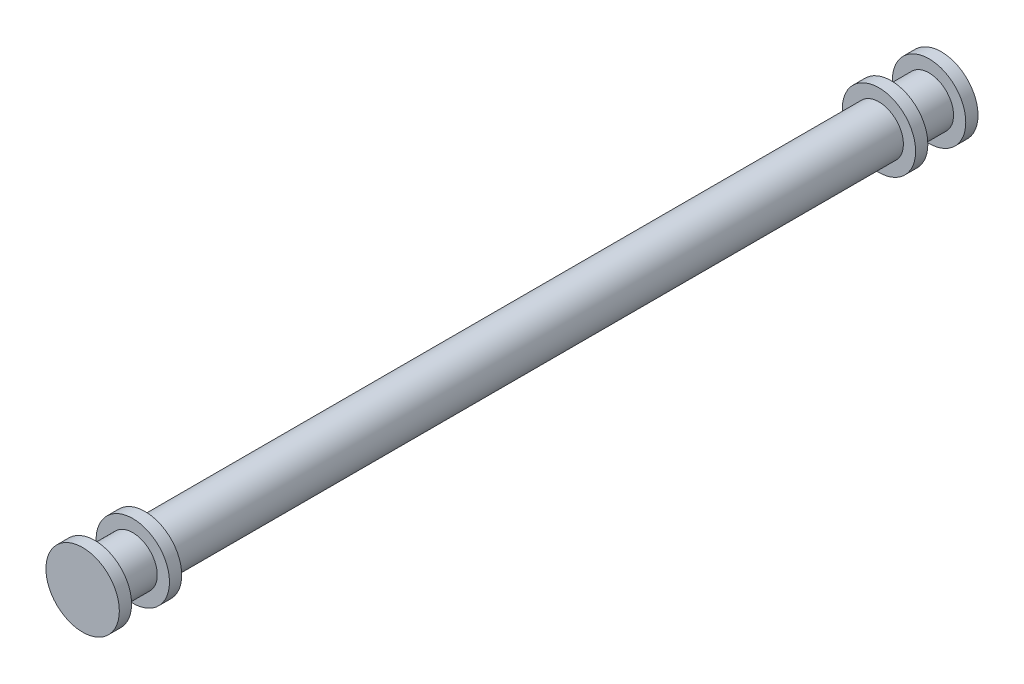
ISO-10303-21;
HEADER;
FILE_DESCRIPTION(('STEP AP214'),'2;1');
FILE_NAME('part.step','',(''),(''),'','','');
FILE_SCHEMA(('AUTOMOTIVE_DESIGN { 1 0 10303 214 1 1 1 1 }'));
ENDSEC;
DATA;
#1=APPLICATION_CONTEXT('core data for automotive mechanical design processes');
#2=APPLICATION_PROTOCOL_DEFINITION('international standard','automotive_design',2000,#1);
#3=PRODUCT_CONTEXT('',#1,'mechanical');
#4=PRODUCT('Part','Part','',(#3));
#5=PRODUCT_RELATED_PRODUCT_CATEGORY('part','',(#4));
#6=PRODUCT_DEFINITION_FORMATION('','',#4);
#7=PRODUCT_DEFINITION_CONTEXT('part definition',#1,'design');
#8=PRODUCT_DEFINITION('design','',#6,#7);
#9=PRODUCT_DEFINITION_SHAPE('','',#8);
#10=(LENGTH_UNIT() NAMED_UNIT(*) SI_UNIT(.MILLI.,.METRE.));
#11=(NAMED_UNIT(*) PLANE_ANGLE_UNIT() SI_UNIT($,.RADIAN.));
#12=(NAMED_UNIT(*) SI_UNIT($,.STERADIAN.) SOLID_ANGLE_UNIT());
#13=UNCERTAINTY_MEASURE_WITH_UNIT(LENGTH_MEASURE(1.E-05),#10,'distance_accuracy_value','');
#14=(GEOMETRIC_REPRESENTATION_CONTEXT(3) GLOBAL_UNCERTAINTY_ASSIGNED_CONTEXT((#13)) GLOBAL_UNIT_ASSIGNED_CONTEXT((#10,
#11,#12)) REPRESENTATION_CONTEXT('',''));
#15=CARTESIAN_POINT('',(0.,0.,0.));
#16=DIRECTION('',(0.,0.,1.));
#17=DIRECTION('',(1.,0.,0.));
#18=AXIS2_PLACEMENT_3D('',#15,#16,#17);
#19=CARTESIAN_POINT('',(0.,0.,60.));
#20=DIRECTION('',(0.,0.,-1.));
#21=DIRECTION('',(-1.,0.,0.));
#22=AXIS2_PLACEMENT_3D('',#19,#20,#21);
#23=CYLINDRICAL_SURFACE('',#22,4.);
#24=CARTESIAN_POINT('',(0.,0.,60.));
#25=DIRECTION('',(0.,0.,1.));
#26=DIRECTION('',(1.,0.,0.));
#27=AXIS2_PLACEMENT_3D('',#24,#25,#26);
#28=CIRCLE('',#27,4.);
#29=CARTESIAN_POINT('',(4.,0.,60.));
#30=VERTEX_POINT('',#29);
#31=EDGE_CURVE('E45',#30,#30,#28,.T.);
#32=ORIENTED_EDGE('',*,*,#31,.F.);
#33=EDGE_LOOP('',(#32));
#34=FACE_BOUND('',#33,.T.);
#35=CARTESIAN_POINT('',(0.,0.,-60.));
#36=DIRECTION('',(0.,0.,1.));
#37=DIRECTION('',(1.,0.,0.));
#38=AXIS2_PLACEMENT_3D('',#35,#36,#37);
#39=CIRCLE('',#38,4.);
#40=CARTESIAN_POINT('',(4.,0.,-60.));
#41=VERTEX_POINT('',#40);
#42=EDGE_CURVE('E40',#41,#41,#39,.T.);
#43=ORIENTED_EDGE('',*,*,#42,.T.);
#44=EDGE_LOOP('',(#43));
#45=FACE_BOUND('',#44,.T.);
#46=ADVANCED_FACE('F37',(#34,#45),#23,.T.);
#47=CARTESIAN_POINT('',(0.,0.,62.));
#48=DIRECTION('',(0.,0.,-1.));
#49=DIRECTION('',(-1.,0.,0.));
#50=AXIS2_PLACEMENT_3D('',#47,#48,#49);
#51=CYLINDRICAL_SURFACE('',#50,6.);
#52=CARTESIAN_POINT('',(0.,0.,62.));
#53=DIRECTION('',(0.,0.,1.));
#54=DIRECTION('',(1.,0.,0.));
#55=AXIS2_PLACEMENT_3D('',#52,#53,#54);
#56=CIRCLE('',#55,6.);
#57=CARTESIAN_POINT('',(6.,0.,62.));
#58=VERTEX_POINT('',#57);
#59=EDGE_CURVE('E51',#58,#58,#56,.T.);
#60=ORIENTED_EDGE('',*,*,#59,.F.);
#61=EDGE_LOOP('',(#60));
#62=FACE_BOUND('',#61,.T.);
#63=CARTESIAN_POINT('',(0.,0.,60.));
#64=DIRECTION('',(0.,0.,1.));
#65=DIRECTION('',(1.,0.,0.));
#66=AXIS2_PLACEMENT_3D('',#63,#64,#65);
#67=CIRCLE('',#66,6.);
#68=CARTESIAN_POINT('',(6.,0.,60.));
#69=VERTEX_POINT('',#68);
#70=EDGE_CURVE('E59',#69,#69,#67,.T.);
#71=ORIENTED_EDGE('',*,*,#70,.T.);
#72=EDGE_LOOP('',(#71));
#73=FACE_BOUND('',#72,.T.);
#74=ADVANCED_FACE('F119',(#62,#73),#51,.T.);
#75=CARTESIAN_POINT('',(0.,0.,62.));
#76=DIRECTION('',(0.,0.,1.));
#77=DIRECTION('',(1.,0.,0.));
#78=AXIS2_PLACEMENT_3D('',#75,#76,#77);
#79=PLANE('',#78);
#80=CARTESIAN_POINT('',(0.,0.,62.));
#81=DIRECTION('',(0.,0.,1.));
#82=DIRECTION('',(1.,0.,0.));
#83=AXIS2_PLACEMENT_3D('',#80,#81,#82);
#84=CIRCLE('',#83,4.);
#85=CARTESIAN_POINT('',(-4.,0.,62.));
#86=VERTEX_POINT('',#85);
#87=EDGE_CURVE('E10',#86,#86,#84,.T.);
#88=ORIENTED_EDGE('',*,*,#87,.F.);
#89=EDGE_LOOP('',(#88));
#90=FACE_BOUND('',#89,.T.);
#91=ORIENTED_EDGE('',*,*,#59,.T.);
#92=EDGE_LOOP('',(#91));
#93=FACE_BOUND('',#92,.T.);
#94=ADVANCED_FACE('F124',(#90,#93),#79,.T.);
#95=CARTESIAN_POINT('',(0.,0.,60.));
#96=DIRECTION('',(0.,0.,1.));
#97=DIRECTION('',(1.,0.,0.));
#98=AXIS2_PLACEMENT_3D('',#95,#96,#97);
#99=PLANE('',#98);
#100=ORIENTED_EDGE('',*,*,#31,.T.);
#101=EDGE_LOOP('',(#100));
#102=FACE_BOUND('',#101,.T.);
#103=ORIENTED_EDGE('',*,*,#70,.F.);
#104=EDGE_LOOP('',(#103));
#105=FACE_BOUND('',#104,.T.);
#106=ADVANCED_FACE('F162',(#102,#105),#99,.F.);
#107=CARTESIAN_POINT('',(0.,0.,68.2));
#108=DIRECTION('',(0.,0.,-1.));
#109=DIRECTION('',(-1.,0.,0.));
#110=AXIS2_PLACEMENT_3D('',#107,#108,#109);
#111=CYLINDRICAL_SURFACE('',#110,4.);
#112=CARTESIAN_POINT('',(0.,0.,68.2));
#113=DIRECTION('',(0.,0.,1.));
#114=DIRECTION('',(1.,0.,0.));
#115=AXIS2_PLACEMENT_3D('',#112,#113,#114);
#116=CIRCLE('',#115,4.);
#117=CARTESIAN_POINT('',(-4.,0.,68.2));
#118=VERTEX_POINT('',#117);
#119=EDGE_CURVE('E54',#118,#118,#116,.T.);
#120=CARTESIAN_POINT('',(-4.,0.,68.2));
#121=CARTESIAN_POINT('',(-4.,0.,68.1354166666667));
#122=CARTESIAN_POINT('',(-4.,0.,68.0708333333333));
#123=CARTESIAN_POINT('',(-4.,0.,67.9416666666666));
#124=CARTESIAN_POINT('',(-4.,0.,67.8770833333333));
#125=CARTESIAN_POINT('',(-4.,0.,67.7479166666667));
#126=CARTESIAN_POINT('',(-4.,0.,67.6833333333333));
#127=CARTESIAN_POINT('',(-4.,0.,67.5541666666666));
#128=CARTESIAN_POINT('',(-4.,0.,67.4895833333333));
#129=CARTESIAN_POINT('',(-4.,0.,67.3604166666667));
#130=CARTESIAN_POINT('',(-4.,0.,67.2958333333333));
#131=CARTESIAN_POINT('',(-4.,0.,67.1666666666667));
#132=CARTESIAN_POINT('',(-4.,0.,67.1020833333333));
#133=CARTESIAN_POINT('',(-4.,0.,66.9729166666667));
#134=CARTESIAN_POINT('',(-4.,0.,66.9083333333333));
#135=CARTESIAN_POINT('',(-4.,0.,66.7791666666667));
#136=CARTESIAN_POINT('',(-4.,0.,66.7145833333333));
#137=CARTESIAN_POINT('',(-4.,0.,66.5854166666667));
#138=CARTESIAN_POINT('',(-4.,0.,66.5208333333333));
#139=CARTESIAN_POINT('',(-4.,0.,66.3916666666667));
#140=CARTESIAN_POINT('',(-4.,0.,66.3270833333333));
#141=CARTESIAN_POINT('',(-4.,0.,66.1979166666667));
#142=CARTESIAN_POINT('',(-4.,0.,66.1333333333333));
#143=CARTESIAN_POINT('',(-4.,0.,66.0041666666666));
#144=CARTESIAN_POINT('',(-4.,0.,65.9395833333333));
#145=CARTESIAN_POINT('',(-4.,0.,65.8104166666667));
#146=CARTESIAN_POINT('',(-4.,0.,65.7458333333333));
#147=CARTESIAN_POINT('',(-4.,0.,65.6166666666667));
#148=CARTESIAN_POINT('',(-4.,0.,65.5520833333333));
#149=CARTESIAN_POINT('',(-4.,0.,65.4229166666667));
#150=CARTESIAN_POINT('',(-4.,0.,65.3583333333333));
#151=CARTESIAN_POINT('',(-4.,0.,65.2291666666667));
#152=CARTESIAN_POINT('',(-4.,0.,65.1645833333333));
#153=CARTESIAN_POINT('',(-4.,0.,65.0354166666667));
#154=CARTESIAN_POINT('',(-4.,0.,64.9708333333333));
#155=CARTESIAN_POINT('',(-4.,0.,64.8416666666667));
#156=CARTESIAN_POINT('',(-4.,0.,64.7770833333333));
#157=CARTESIAN_POINT('',(-4.,0.,64.6479166666666));
#158=CARTESIAN_POINT('',(-4.,0.,64.5833333333333));
#159=CARTESIAN_POINT('',(-4.,0.,64.4541666666667));
#160=CARTESIAN_POINT('',(-4.,0.,64.3895833333333));
#161=CARTESIAN_POINT('',(-4.,0.,64.2604166666667));
#162=CARTESIAN_POINT('',(-4.,0.,64.1958333333333));
#163=CARTESIAN_POINT('',(-4.,0.,64.0666666666667));
#164=CARTESIAN_POINT('',(-4.,0.,64.0020833333333));
#165=CARTESIAN_POINT('',(-4.,0.,63.8729166666667));
#166=CARTESIAN_POINT('',(-4.,0.,63.8083333333333));
#167=CARTESIAN_POINT('',(-4.,0.,63.6791666666667));
#168=CARTESIAN_POINT('',(-4.,0.,63.6145833333333));
#169=CARTESIAN_POINT('',(-4.,0.,63.4854166666667));
#170=CARTESIAN_POINT('',(-4.,0.,63.4208333333333));
#171=CARTESIAN_POINT('',(-4.,0.,63.2916666666667));
#172=CARTESIAN_POINT('',(-4.,0.,63.2270833333333));
#173=CARTESIAN_POINT('',(-4.,0.,63.0979166666667));
#174=CARTESIAN_POINT('',(-4.,0.,63.0333333333333));
#175=CARTESIAN_POINT('',(-4.,0.,62.9041666666667));
#176=CARTESIAN_POINT('',(-4.,0.,62.8395833333333));
#177=CARTESIAN_POINT('',(-4.,0.,62.7104166666667));
#178=CARTESIAN_POINT('',(-4.,0.,62.6458333333333));
#179=CARTESIAN_POINT('',(-4.,0.,62.5166666666667));
#180=CARTESIAN_POINT('',(-4.,0.,62.4520833333333));
#181=CARTESIAN_POINT('',(-4.,0.,62.3229166666667));
#182=CARTESIAN_POINT('',(-4.,0.,62.2583333333333));
#183=CARTESIAN_POINT('',(-4.,0.,62.1291666666667));
#184=CARTESIAN_POINT('',(-4.,0.,62.0645833333333));
#185=CARTESIAN_POINT('',(-4.,0.,62.));
#186=B_SPLINE_CURVE_WITH_KNOTS('',3,(#120,#121,#122,#123,#124,#125,#126,#127,#128,#129,#130,
#131,#132,#133,#134,#135,#136,#137,#138,#139,#140,#141,#142,#143,#144,#145,#146,#147,#148,#149,
#150,#151,#152,#153,#154,#155,#156,#157,#158,#159,#160,#161,#162,#163,#164,#165,#166,#167,#168,
#169,#170,#171,#172,#173,#174,#175,#176,#177,#178,#179,#180,#181,#182,#183,#184,#185),
.UNSPECIFIED.,.F.,.F.,(4,2,2,2,2,2,2,2,2,2,2,2,2,2,2,2,2,2,2,2,2,2,2,2,2,2,2,2,2,2,2,2,4),(0.,
0.193750000000006,0.387500000000013,0.581250000000005,0.775000000000012,0.968750000000004,
1.16250000000001,1.35625,1.55000000000001,1.74375,1.93750000000001,2.13125,2.32500000000001,
2.51875,2.71250000000001,2.90625,3.10000000000001,3.29375,3.4875,3.68125000000001,3.875,4.06875,
4.2625,4.45625000000001,4.65,4.84375000000001,5.0375,5.23125000000001,5.425,5.61875000000001,
5.8125,6.00625,6.2),.UNSPECIFIED.);
#187=EDGE_CURVE('BSEAM158',#118,#86,#186,.T.);
#188=ORIENTED_EDGE('',*,*,#119,.F.);
#189=ORIENTED_EDGE('',*,*,#87,.T.);
#190=ORIENTED_EDGE('',*,*,#187,.T.);
#191=ORIENTED_EDGE('',*,*,#187,.F.);
#192=EDGE_LOOP('',(#188,#190,#189,#191));
#193=FACE_BOUND('',#192,.T.);
#194=ADVANCED_FACE('F158',(#193),#111,.T.);
#195=CARTESIAN_POINT('',(0.,0.,70.2));
#196=DIRECTION('',(0.,0.,-1.));
#197=DIRECTION('',(-1.,0.,0.));
#198=AXIS2_PLACEMENT_3D('',#195,#196,#197);
#199=CYLINDRICAL_SURFACE('',#198,6.);
#200=CARTESIAN_POINT('',(0.,0.,70.2));
#201=DIRECTION('',(0.,0.,1.));
#202=DIRECTION('',(1.,0.,0.));
#203=AXIS2_PLACEMENT_3D('',#200,#201,#202);
#204=CIRCLE('',#203,6.);
#205=CARTESIAN_POINT('',(6.,0.,70.2));
#206=VERTEX_POINT('',#205);
#207=EDGE_CURVE('E66',#206,#206,#204,.T.);
#208=ORIENTED_EDGE('',*,*,#207,.F.);
#209=EDGE_LOOP('',(#208));
#210=FACE_BOUND('',#209,.T.);
#211=CARTESIAN_POINT('',(0.,0.,68.2));
#212=DIRECTION('',(0.,0.,1.));
#213=DIRECTION('',(1.,0.,0.));
#214=AXIS2_PLACEMENT_3D('',#211,#212,#213);
#215=CIRCLE('',#214,6.);
#216=CARTESIAN_POINT('',(6.,0.,68.2));
#217=VERTEX_POINT('',#216);
#218=EDGE_CURVE('E71',#217,#217,#215,.T.);
#219=ORIENTED_EDGE('',*,*,#218,.T.);
#220=EDGE_LOOP('',(#219));
#221=FACE_BOUND('',#220,.T.);
#222=ADVANCED_FACE('F154',(#210,#221),#199,.T.);
#223=CARTESIAN_POINT('',(0.,0.,70.2));
#224=DIRECTION('',(0.,0.,1.));
#225=DIRECTION('',(1.,0.,0.));
#226=AXIS2_PLACEMENT_3D('',#223,#224,#225);
#227=PLANE('',#226);
#228=ORIENTED_EDGE('',*,*,#207,.T.);
#229=EDGE_LOOP('',(#228));
#230=FACE_BOUND('',#229,.T.);
#231=ADVANCED_FACE('F150',(#230),#227,.T.);
#232=CARTESIAN_POINT('',(0.,0.,68.2));
#233=DIRECTION('',(0.,0.,1.));
#234=DIRECTION('',(1.,0.,0.));
#235=AXIS2_PLACEMENT_3D('',#232,#233,#234);
#236=PLANE('',#235);
#237=ORIENTED_EDGE('',*,*,#119,.T.);
#238=EDGE_LOOP('',(#237));
#239=FACE_BOUND('',#238,.T.);
#240=ORIENTED_EDGE('',*,*,#218,.F.);
#241=EDGE_LOOP('',(#240));
#242=FACE_BOUND('',#241,.T.);
#243=ADVANCED_FACE('F141',(#239,#242),#236,.F.);
#244=CARTESIAN_POINT('',(0.,0.,-62.));
#245=DIRECTION('',(0.,0.,1.));
#246=DIRECTION('',(1.,0.,0.));
#247=AXIS2_PLACEMENT_3D('',#244,#245,#246);
#248=CYLINDRICAL_SURFACE('',#247,6.);
#249=CARTESIAN_POINT('',(0.,0.,-62.));
#250=DIRECTION('',(0.,0.,1.));
#251=DIRECTION('',(1.,0.,0.));
#252=AXIS2_PLACEMENT_3D('',#249,#250,#251);
#253=CIRCLE('',#252,6.);
#254=CARTESIAN_POINT('',(6.,0.,-62.));
#255=VERTEX_POINT('',#254);
#256=EDGE_CURVE('E82',#255,#255,#253,.T.);
#257=ORIENTED_EDGE('',*,*,#256,.T.);
#258=EDGE_LOOP('',(#257));
#259=FACE_BOUND('',#258,.T.);
#260=CARTESIAN_POINT('',(0.,0.,-60.));
#261=DIRECTION('',(0.,0.,1.));
#262=DIRECTION('',(1.,0.,0.));
#263=AXIS2_PLACEMENT_3D('',#260,#261,#262);
#264=CIRCLE('',#263,6.);
#265=CARTESIAN_POINT('',(6.,0.,-60.));
#266=VERTEX_POINT('',#265);
#267=EDGE_CURVE('E78',#266,#266,#264,.T.);
#268=ORIENTED_EDGE('',*,*,#267,.F.);
#269=EDGE_LOOP('',(#268));
#270=FACE_BOUND('',#269,.T.);
#271=ADVANCED_FACE('F139',(#259,#270),#248,.T.);
#272=CARTESIAN_POINT('',(0.,0.,-62.));
#273=DIRECTION('',(0.,0.,-1.));
#274=DIRECTION('',(1.,0.,0.));
#275=AXIS2_PLACEMENT_3D('',#272,#273,#274);
#276=PLANE('',#275);
#277=CARTESIAN_POINT('',(0.,0.,-62.));
#278=DIRECTION('',(0.,0.,1.));
#279=DIRECTION('',(1.,0.,0.));
#280=AXIS2_PLACEMENT_3D('',#277,#278,#279);
#281=CIRCLE('',#280,4.);
#282=CARTESIAN_POINT('',(4.,0.,-62.));
#283=VERTEX_POINT('',#282);
#284=EDGE_CURVE('E83',#283,#283,#281,.T.);
#285=ORIENTED_EDGE('',*,*,#284,.T.);
#286=EDGE_LOOP('',(#285));
#287=FACE_BOUND('',#286,.T.);
#288=ORIENTED_EDGE('',*,*,#256,.F.);
#289=EDGE_LOOP('',(#288));
#290=FACE_BOUND('',#289,.T.);
#291=ADVANCED_FACE('F135',(#287,#290),#276,.T.);
#292=CARTESIAN_POINT('',(0.,0.,-60.));
#293=DIRECTION('',(0.,0.,-1.));
#294=DIRECTION('',(1.,0.,0.));
#295=AXIS2_PLACEMENT_3D('',#292,#293,#294);
#296=PLANE('',#295);
#297=ORIENTED_EDGE('',*,*,#42,.F.);
#298=EDGE_LOOP('',(#297));
#299=FACE_BOUND('',#298,.T.);
#300=ORIENTED_EDGE('',*,*,#267,.T.);
#301=EDGE_LOOP('',(#300));
#302=FACE_BOUND('',#301,.T.);
#303=ADVANCED_FACE('F132',(#299,#302),#296,.F.);
#304=CARTESIAN_POINT('',(0.,0.,-68.2));
#305=DIRECTION('',(0.,0.,1.));
#306=DIRECTION('',(1.,0.,0.));
#307=AXIS2_PLACEMENT_3D('',#304,#305,#306);
#308=CYLINDRICAL_SURFACE('',#307,4.);
#309=CARTESIAN_POINT('',(0.,0.,-68.2));
#310=DIRECTION('',(0.,0.,1.));
#311=DIRECTION('',(1.,0.,0.));
#312=AXIS2_PLACEMENT_3D('',#309,#310,#311);
#313=CIRCLE('',#312,4.);
#314=CARTESIAN_POINT('',(4.,0.,-68.2));
#315=VERTEX_POINT('',#314);
#316=EDGE_CURVE('E90',#315,#315,#313,.T.);
#317=CARTESIAN_POINT('',(4.,0.,-68.2));
#318=CARTESIAN_POINT('',(4.,0.,-68.1354166666667));
#319=CARTESIAN_POINT('',(4.,0.,-68.0708333333333));
#320=CARTESIAN_POINT('',(4.,0.,-67.9416666666667));
#321=CARTESIAN_POINT('',(4.,0.,-67.8770833333333));
#322=CARTESIAN_POINT('',(4.,0.,-67.7479166666667));
#323=CARTESIAN_POINT('',(4.,0.,-67.6833333333333));
#324=CARTESIAN_POINT('',(4.,0.,-67.5541666666667));
#325=CARTESIAN_POINT('',(4.,0.,-67.4895833333333));
#326=CARTESIAN_POINT('',(4.,0.,-67.3604166666667));
#327=CARTESIAN_POINT('',(4.,0.,-67.2958333333333));
#328=CARTESIAN_POINT('',(4.,0.,-67.1666666666667));
#329=CARTESIAN_POINT('',(4.,0.,-67.1020833333333));
#330=CARTESIAN_POINT('',(4.,0.,-66.9729166666667));
#331=CARTESIAN_POINT('',(4.,0.,-66.9083333333333));
#332=CARTESIAN_POINT('',(4.,0.,-66.7791666666667));
#333=CARTESIAN_POINT('',(4.,0.,-66.7145833333333));
#334=CARTESIAN_POINT('',(4.,0.,-66.5854166666667));
#335=CARTESIAN_POINT('',(4.,0.,-66.5208333333333));
#336=CARTESIAN_POINT('',(4.,0.,-66.3916666666667));
#337=CARTESIAN_POINT('',(4.,0.,-66.3270833333333));
#338=CARTESIAN_POINT('',(4.,0.,-66.1979166666667));
#339=CARTESIAN_POINT('',(4.,0.,-66.1333333333333));
#340=CARTESIAN_POINT('',(4.,0.,-66.0041666666667));
#341=CARTESIAN_POINT('',(4.,0.,-65.9395833333333));
#342=CARTESIAN_POINT('',(4.,0.,-65.8104166666667));
#343=CARTESIAN_POINT('',(4.,0.,-65.7458333333333));
#344=CARTESIAN_POINT('',(4.,0.,-65.6166666666667));
#345=CARTESIAN_POINT('',(4.,0.,-65.5520833333333));
#346=CARTESIAN_POINT('',(4.,0.,-65.4229166666667));
#347=CARTESIAN_POINT('',(4.,0.,-65.3583333333333));
#348=CARTESIAN_POINT('',(4.,0.,-65.2291666666667));
#349=CARTESIAN_POINT('',(4.,0.,-65.1645833333333));
#350=CARTESIAN_POINT('',(4.,0.,-65.0354166666667));
#351=CARTESIAN_POINT('',(4.,0.,-64.9708333333333));
#352=CARTESIAN_POINT('',(4.,0.,-64.8416666666667));
#353=CARTESIAN_POINT('',(4.,0.,-64.7770833333333));
#354=CARTESIAN_POINT('',(4.,0.,-64.6479166666667));
#355=CARTESIAN_POINT('',(4.,0.,-64.5833333333333));
#356=CARTESIAN_POINT('',(4.,0.,-64.4541666666667));
#357=CARTESIAN_POINT('',(4.,0.,-64.3895833333333));
#358=CARTESIAN_POINT('',(4.,0.,-64.2604166666667));
#359=CARTESIAN_POINT('',(4.,0.,-64.1958333333333));
#360=CARTESIAN_POINT('',(4.,0.,-64.0666666666667));
#361=CARTESIAN_POINT('',(4.,0.,-64.0020833333333));
#362=CARTESIAN_POINT('',(4.,0.,-63.8729166666667));
#363=CARTESIAN_POINT('',(4.,0.,-63.8083333333333));
#364=CARTESIAN_POINT('',(4.,0.,-63.6791666666667));
#365=CARTESIAN_POINT('',(4.,0.,-63.6145833333333));
#366=CARTESIAN_POINT('',(4.,0.,-63.4854166666667));
#367=CARTESIAN_POINT('',(4.,0.,-63.4208333333333));
#368=CARTESIAN_POINT('',(4.,0.,-63.2916666666667));
#369=CARTESIAN_POINT('',(4.,0.,-63.2270833333333));
#370=CARTESIAN_POINT('',(4.,0.,-63.0979166666667));
#371=CARTESIAN_POINT('',(4.,0.,-63.0333333333333));
#372=CARTESIAN_POINT('',(4.,0.,-62.9041666666667));
#373=CARTESIAN_POINT('',(4.,0.,-62.8395833333333));
#374=CARTESIAN_POINT('',(4.,0.,-62.7104166666667));
#375=CARTESIAN_POINT('',(4.,0.,-62.6458333333333));
#376=CARTESIAN_POINT('',(4.,0.,-62.5166666666667));
#377=CARTESIAN_POINT('',(4.,0.,-62.4520833333333));
#378=CARTESIAN_POINT('',(4.,0.,-62.3229166666667));
#379=CARTESIAN_POINT('',(4.,0.,-62.2583333333333));
#380=CARTESIAN_POINT('',(4.,0.,-62.1291666666667));
#381=CARTESIAN_POINT('',(4.,0.,-62.0645833333333));
#382=CARTESIAN_POINT('',(4.,0.,-62.));
#383=B_SPLINE_CURVE_WITH_KNOTS('',3,(#317,#318,#319,#320,#321,#322,#323,#324,#325,#326,#327,
#328,#329,#330,#331,#332,#333,#334,#335,#336,#337,#338,#339,#340,#341,#342,#343,#344,#345,#346,
#347,#348,#349,#350,#351,#352,#353,#354,#355,#356,#357,#358,#359,#360,#361,#362,#363,#364,#365,
#366,#367,#368,#369,#370,#371,#372,#373,#374,#375,#376,#377,#378,#379,#380,#381,#382),
.UNSPECIFIED.,.F.,.F.,(4,2,2,2,2,2,2,2,2,2,2,2,2,2,2,2,2,2,2,2,2,2,2,2,2,2,2,2,2,2,2,2,4),(0.,
0.193749999999993,0.387499999999999,0.581249999999991,0.774999999999998,0.96874999999999,1.1625,
1.35624999999999,1.55,1.74374999999999,1.93749999999999,2.13124999999999,2.32499999999999,
2.51874999999999,2.71249999999999,2.90625,3.09999999999999,3.29375,3.48749999999999,3.68125,
3.87499999999999,4.06875,4.26249999999999,4.45625,4.64999999999999,4.84374999999999,
5.03749999999999,5.23124999999999,5.425,5.61874999999999,5.81249999999999,6.00624999999999,
6.19999999999999),.UNSPECIFIED.);
#384=EDGE_CURVE('BSEAM116',#315,#283,#383,.T.);
#385=ORIENTED_EDGE('',*,*,#316,.T.);
#386=ORIENTED_EDGE('',*,*,#284,.F.);
#387=ORIENTED_EDGE('',*,*,#384,.T.);
#388=ORIENTED_EDGE('',*,*,#384,.F.);
#389=EDGE_LOOP('',(#385,#387,#386,#388));
#390=FACE_BOUND('',#389,.T.);
#391=ADVANCED_FACE('F116',(#390),#308,.T.);
#392=CARTESIAN_POINT('',(0.,0.,-70.2));
#393=DIRECTION('',(0.,0.,1.));
#394=DIRECTION('',(1.,0.,0.));
#395=AXIS2_PLACEMENT_3D('',#392,#393,#394);
#396=CYLINDRICAL_SURFACE('',#395,6.);
#397=CARTESIAN_POINT('',(0.,0.,-70.2));
#398=DIRECTION('',(0.,0.,1.));
#399=DIRECTION('',(1.,0.,0.));
#400=AXIS2_PLACEMENT_3D('',#397,#398,#399);
#401=CIRCLE('',#400,6.);
#402=CARTESIAN_POINT('',(6.,0.,-70.2));
#403=VERTEX_POINT('',#402);
#404=EDGE_CURVE('E94',#403,#403,#401,.T.);
#405=ORIENTED_EDGE('',*,*,#404,.T.);
#406=EDGE_LOOP('',(#405));
#407=FACE_BOUND('',#406,.T.);
#408=CARTESIAN_POINT('',(0.,0.,-68.2));
#409=DIRECTION('',(0.,0.,1.));
#410=DIRECTION('',(1.,0.,0.));
#411=AXIS2_PLACEMENT_3D('',#408,#409,#410);
#412=CIRCLE('',#411,6.);
#413=CARTESIAN_POINT('',(6.,0.,-68.2));
#414=VERTEX_POINT('',#413);
#415=EDGE_CURVE('E95',#414,#414,#412,.T.);
#416=ORIENTED_EDGE('',*,*,#415,.F.);
#417=EDGE_LOOP('',(#416));
#418=FACE_BOUND('',#417,.T.);
#419=ADVANCED_FACE('F103',(#407,#418),#396,.T.);
#420=CARTESIAN_POINT('',(0.,0.,-70.2));
#421=DIRECTION('',(0.,0.,-1.));
#422=DIRECTION('',(1.,0.,0.));
#423=AXIS2_PLACEMENT_3D('',#420,#421,#422);
#424=PLANE('',#423);
#425=ORIENTED_EDGE('',*,*,#404,.F.);
#426=EDGE_LOOP('',(#425));
#427=FACE_BOUND('',#426,.T.);
#428=ADVANCED_FACE('F106',(#427),#424,.T.);
#429=CARTESIAN_POINT('',(0.,0.,-68.2));
#430=DIRECTION('',(0.,0.,-1.));
#431=DIRECTION('',(1.,0.,0.));
#432=AXIS2_PLACEMENT_3D('',#429,#430,#431);
#433=PLANE('',#432);
#434=ORIENTED_EDGE('',*,*,#316,.F.);
#435=EDGE_LOOP('',(#434));
#436=FACE_BOUND('',#435,.T.);
#437=ORIENTED_EDGE('',*,*,#415,.T.);
#438=EDGE_LOOP('',(#437));
#439=FACE_BOUND('',#438,.T.);
#440=ADVANCED_FACE('F108',(#436,#439),#433,.F.);
#441=CLOSED_SHELL('',(#46,#74,#94,#106,#194,#222,#231,#243,#271,#291,#303,#391,#419,#428,#440));
#442=MANIFOLD_SOLID_BREP('B2',#441);
#443=ADVANCED_BREP_SHAPE_REPRESENTATION('',(#18,#442),#14);
#444=SHAPE_DEFINITION_REPRESENTATION(#9,#443);
ENDSEC;
END-ISO-10303-21;
